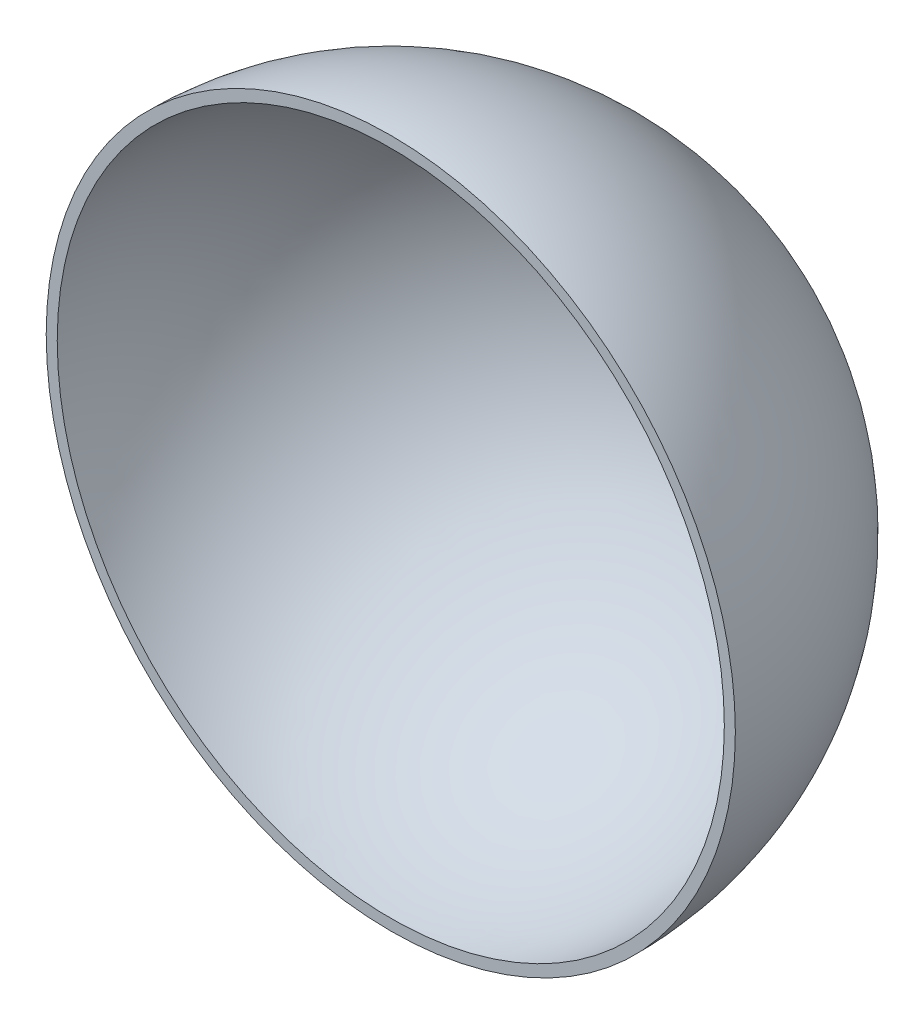
ISO-10303-21;
HEADER;
FILE_DESCRIPTION(('STEP AP214'),'2;1');
FILE_NAME('part.step','',(''),(''),'','','');
FILE_SCHEMA(('AUTOMOTIVE_DESIGN { 1 0 10303 214 1 1 1 1 }'));
ENDSEC;
DATA;
#1=APPLICATION_CONTEXT('core data for automotive mechanical design processes');
#2=APPLICATION_PROTOCOL_DEFINITION('international standard','automotive_design',2000,#1);
#3=PRODUCT_CONTEXT('',#1,'mechanical');
#4=PRODUCT('Part','Part','',(#3));
#5=PRODUCT_RELATED_PRODUCT_CATEGORY('part','',(#4));
#6=PRODUCT_DEFINITION_FORMATION('','',#4);
#7=PRODUCT_DEFINITION_CONTEXT('part definition',#1,'design');
#8=PRODUCT_DEFINITION('design','',#6,#7);
#9=PRODUCT_DEFINITION_SHAPE('','',#8);
#10=(LENGTH_UNIT() NAMED_UNIT(*) SI_UNIT(.MILLI.,.METRE.));
#11=(NAMED_UNIT(*) PLANE_ANGLE_UNIT() SI_UNIT($,.RADIAN.));
#12=(NAMED_UNIT(*) SI_UNIT($,.STERADIAN.) SOLID_ANGLE_UNIT());
#13=UNCERTAINTY_MEASURE_WITH_UNIT(LENGTH_MEASURE(1.E-05),#10,'distance_accuracy_value','');
#14=(GEOMETRIC_REPRESENTATION_CONTEXT(3) GLOBAL_UNCERTAINTY_ASSIGNED_CONTEXT((#13)) GLOBAL_UNIT_ASSIGNED_CONTEXT((#10,
#11,#12)) REPRESENTATION_CONTEXT('',''));
#15=CARTESIAN_POINT('',(0.,0.,0.));
#16=DIRECTION('',(0.,0.,1.));
#17=DIRECTION('',(1.,0.,0.));
#18=AXIS2_PLACEMENT_3D('',#15,#16,#17);
#19=CARTESIAN_POINT('',(-1.3375,1.8375,1.425));
#20=DIRECTION('',(1.,0.,0.));
#21=DIRECTION('',(0.,1.,0.));
#22=AXIS2_PLACEMENT_3D('',#19,#20,#21);
#23=SPHERICAL_SURFACE('',#22,0.3025);
#24=CARTESIAN_POINT('',(-1.3375,1.8375,1.425));
#25=DIRECTION('',(0.,0.,-1.));
#26=DIRECTION('',(1.,0.,0.));
#27=AXIS2_PLACEMENT_3D('',#24,#25,#26);
#28=CIRCLE('',#27,0.3025);
#29=CARTESIAN_POINT('',(-1.035,1.83750000001,1.425));
#30=VERTEX_POINT('',#29);
#31=CARTESIAN_POINT('',(-1.64,1.83750000001,1.425));
#32=VERTEX_POINT('',#31);
#33=EDGE_CURVE('E21',#30,#32,#28,.T.);
#34=ORIENTED_EDGE('',*,*,#33,.F.);
#35=CARTESIAN_POINT('',(-1.3375,1.8375,1.425));
#36=DIRECTION('',(0.,0.,1.));
#37=DIRECTION('',(1.,0.,0.));
#38=AXIS2_PLACEMENT_3D('',#35,#36,#37);
#39=CIRCLE('',#38,0.3025);
#40=EDGE_CURVE('E33',#32,#30,#39,.F.);
#41=ORIENTED_EDGE('',*,*,#40,.F.);
#42=EDGE_LOOP('',(#34,#41));
#43=FACE_BOUND('',#42,.T.);
#44=ADVANCED_FACE('F17',(#43),#23,.F.);
#45=CARTESIAN_POINT('',(-1.95,-2.45,1.425));
#46=DIRECTION('',(0.,0.,1.));
#47=DIRECTION('',(1.,0.,0.));
#48=AXIS2_PLACEMENT_3D('',#45,#46,#47);
#49=PLANE('',#48);
#50=ORIENTED_EDGE('',*,*,#40,.T.);
#51=ORIENTED_EDGE('',*,*,#33,.T.);
#52=EDGE_LOOP('',(#50,#51));
#53=FACE_BOUND('',#52,.T.);
#54=CARTESIAN_POINT('',(-1.3375,1.8375,1.425));
#55=DIRECTION('',(0.,0.,1.));
#56=DIRECTION('',(1.,0.,0.));
#57=AXIS2_PLACEMENT_3D('',#54,#55,#56);
#58=CIRCLE('',#57,0.3125);
#59=CARTESIAN_POINT('',(-1.025,1.83750000001,1.425));
#60=VERTEX_POINT('',#59);
#61=CARTESIAN_POINT('',(-1.65,1.83750000001,1.425));
#62=VERTEX_POINT('',#61);
#63=EDGE_CURVE('E26',#60,#62,#58,.F.);
#64=ORIENTED_EDGE('',*,*,#63,.F.);
#65=CARTESIAN_POINT('',(-1.3375,1.8375,1.425));
#66=DIRECTION('',(0.,0.,1.));
#67=DIRECTION('',(1.,0.,0.));
#68=AXIS2_PLACEMENT_3D('',#65,#66,#67);
#69=CIRCLE('',#68,0.3125);
#70=EDGE_CURVE('E11',#62,#60,#69,.F.);
#71=ORIENTED_EDGE('',*,*,#70,.F.);
#72=EDGE_LOOP('',(#64,#71));
#73=FACE_BOUND('',#72,.T.);
#74=ADVANCED_FACE('F43',(#53,#73),#49,.T.);
#75=CARTESIAN_POINT('',(-1.3375,1.8375,1.425));
#76=DIRECTION('',(1.,0.,0.));
#77=DIRECTION('',(0.,1.,0.));
#78=AXIS2_PLACEMENT_3D('',#75,#76,#77);
#79=SPHERICAL_SURFACE('',#78,0.3125);
#80=ORIENTED_EDGE('',*,*,#63,.T.);
#81=ORIENTED_EDGE('',*,*,#70,.T.);
#82=EDGE_LOOP('',(#80,#81));
#83=FACE_BOUND('',#82,.T.);
#84=ADVANCED_FACE('F46',(#83),#79,.T.);
#85=CLOSED_SHELL('',(#44,#74,#84));
#86=MANIFOLD_SOLID_BREP('B1',#85);
#87=ADVANCED_BREP_SHAPE_REPRESENTATION('',(#18,#86),#14);
#88=SHAPE_DEFINITION_REPRESENTATION(#9,#87);
ENDSEC;
END-ISO-10303-21;
